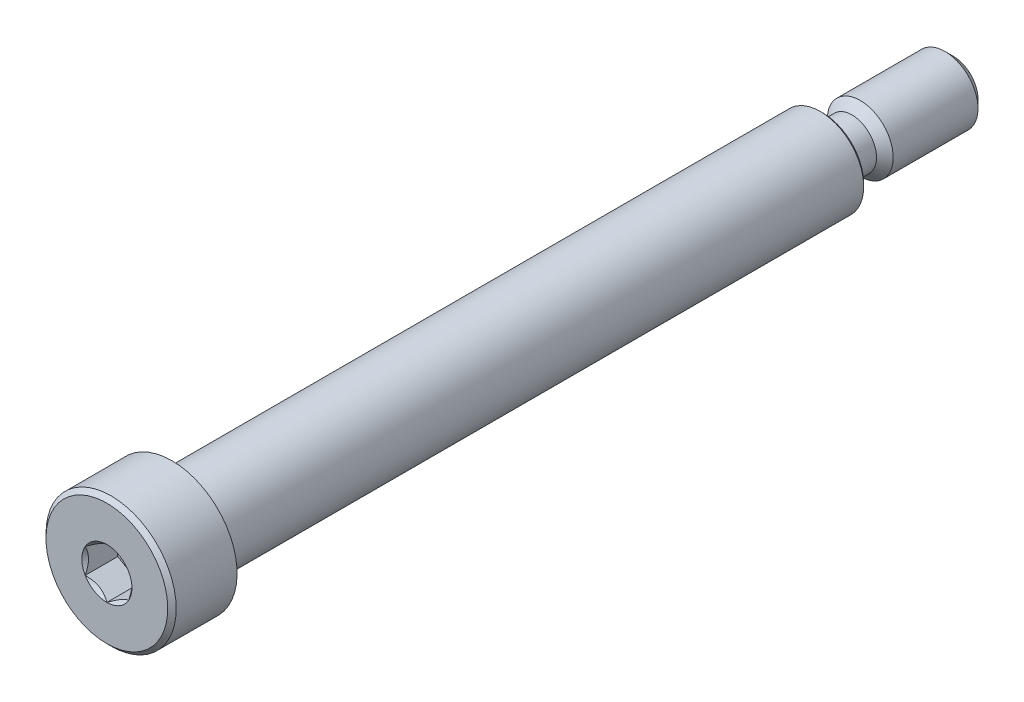
ISO-10303-21;
HEADER;
FILE_DESCRIPTION(('STEP AP214'),'2;1');
FILE_NAME('part.step','',(''),(''),'','','');
FILE_SCHEMA(('AUTOMOTIVE_DESIGN { 1 0 10303 214 1 1 1 1 }'));
ENDSEC;
DATA;
#1=APPLICATION_CONTEXT('core data for automotive mechanical design processes');
#2=APPLICATION_PROTOCOL_DEFINITION('international standard','automotive_design',2000,#1);
#3=PRODUCT_CONTEXT('',#1,'mechanical');
#4=PRODUCT('Part','Part','',(#3));
#5=PRODUCT_RELATED_PRODUCT_CATEGORY('part','',(#4));
#6=PRODUCT_DEFINITION_FORMATION('','',#4);
#7=PRODUCT_DEFINITION_CONTEXT('part definition',#1,'design');
#8=PRODUCT_DEFINITION('design','',#6,#7);
#9=PRODUCT_DEFINITION_SHAPE('','',#8);
#10=(LENGTH_UNIT() NAMED_UNIT(*) SI_UNIT(.MILLI.,.METRE.));
#11=(NAMED_UNIT(*) PLANE_ANGLE_UNIT() SI_UNIT($,.RADIAN.));
#12=(NAMED_UNIT(*) SI_UNIT($,.STERADIAN.) SOLID_ANGLE_UNIT());
#13=UNCERTAINTY_MEASURE_WITH_UNIT(LENGTH_MEASURE(1.E-05),#10,'distance_accuracy_value','');
#14=(GEOMETRIC_REPRESENTATION_CONTEXT(3) GLOBAL_UNCERTAINTY_ASSIGNED_CONTEXT((#13)) GLOBAL_UNIT_ASSIGNED_CONTEXT((#10,
#11,#12)) REPRESENTATION_CONTEXT('',''));
#15=CARTESIAN_POINT('',(0.,0.,0.));
#16=DIRECTION('',(0.,0.,1.));
#17=DIRECTION('',(1.,0.,0.));
#18=AXIS2_PLACEMENT_3D('',#15,#16,#17);
#19=CARTESIAN_POINT('',(0.,0.,0.));
#20=DIRECTION('',(0.,0.,1.));
#21=DIRECTION('',(0.,-1.,0.));
#22=AXIS2_PLACEMENT_3D('',#19,#20,#21);
#23=PLANE('',#22);
#24=CARTESIAN_POINT('',(0.,0.,0.));
#25=DIRECTION('',(0.,0.,1.));
#26=DIRECTION('',(1.,0.,0.));
#27=AXIS2_PLACEMENT_3D('',#24,#25,#26);
#28=CIRCLE('',#27,1.83308710467706);
#29=CARTESIAN_POINT('',(0.,-1.83308710467706,0.));
#30=VERTEX_POINT('',#29);
#31=CARTESIAN_POINT('',(1.58749999999999,-0.916543552338543,0.));
#32=VERTEX_POINT('',#31);
#33=EDGE_CURVE('E62',#30,#32,#28,.T.);
#34=ORIENTED_EDGE('',*,*,#33,.F.);
#35=CARTESIAN_POINT('',(-1.5875,-0.916543552338536,0.));
#36=VERTEX_POINT('',#35);
#37=EDGE_CURVE('E69',#36,#30,#28,.T.);
#38=ORIENTED_EDGE('',*,*,#37,.F.);
#39=CARTESIAN_POINT('',(-1.5875,0.916543552338528,0.));
#40=VERTEX_POINT('',#39);
#41=EDGE_CURVE('E148',#40,#36,#28,.T.);
#42=ORIENTED_EDGE('',*,*,#41,.F.);
#43=CARTESIAN_POINT('',(0.,1.83308710467706,0.));
#44=VERTEX_POINT('',#43);
#45=EDGE_CURVE('E140',#44,#40,#28,.T.);
#46=ORIENTED_EDGE('',*,*,#45,.F.);
#47=CARTESIAN_POINT('',(1.5875,0.916543552338529,0.));
#48=VERTEX_POINT('',#47);
#49=EDGE_CURVE('E111',#48,#44,#28,.T.);
#50=ORIENTED_EDGE('',*,*,#49,.F.);
#51=EDGE_CURVE('E101',#32,#48,#28,.T.);
#52=ORIENTED_EDGE('',*,*,#51,.F.);
#53=EDGE_LOOP('',(#34,#38,#42,#46,#50,#52));
#54=FACE_BOUND('',#53,.T.);
#55=CARTESIAN_POINT('',(0.,0.,0.));
#56=DIRECTION('',(0.,0.,1.));
#57=DIRECTION('',(0.,-1.,0.));
#58=AXIS2_PLACEMENT_3D('',#55,#56,#57);
#59=CIRCLE('',#58,4.45293750000001);
#60=CARTESIAN_POINT('',(0.,-4.45293750000001,0.));
#61=VERTEX_POINT('',#60);
#62=EDGE_CURVE('E234',#61,#61,#59,.T.);
#63=ORIENTED_EDGE('',*,*,#62,.T.);
#64=EDGE_LOOP('',(#63));
#65=FACE_BOUND('',#64,.T.);
#66=ADVANCED_FACE('F41',(#54,#65),#23,.T.);
#67=CARTESIAN_POINT('',(0.,0.,-61.9125));
#68=DIRECTION('',(0.,0.,-1.));
#69=DIRECTION('',(0.,1.,0.));
#70=AXIS2_PLACEMENT_3D('',#67,#68,#69);
#71=CYLINDRICAL_SURFACE('',#70,4.7625);
#72=CARTESIAN_POINT('',(0.,0.,-0.309562499999978));
#73=DIRECTION('',(0.,0.,1.));
#74=DIRECTION('',(0.,-1.,0.));
#75=AXIS2_PLACEMENT_3D('',#72,#73,#74);
#76=CIRCLE('',#75,4.7625);
#77=CARTESIAN_POINT('',(0.,-4.7625,-0.309562499999977));
#78=VERTEX_POINT('',#77);
#79=EDGE_CURVE('E237',#78,#78,#76,.F.);
#80=ORIENTED_EDGE('',*,*,#79,.T.);
#81=EDGE_LOOP('',(#80));
#82=FACE_BOUND('',#81,.T.);
#83=CARTESIAN_POINT('',(0.,0.,-4.7625));
#84=DIRECTION('',(0.,0.,-1.));
#85=DIRECTION('',(0.,1.,0.));
#86=AXIS2_PLACEMENT_3D('',#83,#84,#85);
#87=CIRCLE('',#86,4.7625);
#88=CARTESIAN_POINT('',(0.,4.76249999999999,-4.7625));
#89=VERTEX_POINT('',#88);
#90=EDGE_CURVE('E287',#89,#89,#87,.T.);
#91=ORIENTED_EDGE('',*,*,#90,.F.);
#92=EDGE_LOOP('',(#91));
#93=FACE_BOUND('',#92,.T.);
#94=ADVANCED_FACE('F210',(#82,#93),#71,.T.);
#95=CARTESIAN_POINT('',(0.,-4.7625,-4.7625));
#96=DIRECTION('',(0.,0.,-1.));
#97=DIRECTION('',(0.,1.,0.));
#98=AXIS2_PLACEMENT_3D('',#95,#96,#97);
#99=PLANE('',#98);
#100=ORIENTED_EDGE('',*,*,#90,.T.);
#101=EDGE_LOOP('',(#100));
#102=FACE_BOUND('',#101,.T.);
#103=CARTESIAN_POINT('',(0.,0.,-4.7625));
#104=DIRECTION('',(0.,0.,-1.));
#105=DIRECTION('',(0.,1.,0.));
#106=AXIS2_PLACEMENT_3D('',#103,#104,#105);
#107=CIRCLE('',#106,3.17499999999998);
#108=CARTESIAN_POINT('',(0.,3.17499999999998,-4.7625));
#109=VERTEX_POINT('',#108);
#110=EDGE_CURVE('E277',#109,#109,#107,.T.);
#111=ORIENTED_EDGE('',*,*,#110,.F.);
#112=EDGE_LOOP('',(#111));
#113=FACE_BOUND('',#112,.T.);
#114=ADVANCED_FACE('F215',(#102,#113),#99,.T.);
#115=CARTESIAN_POINT('',(0.,0.,-61.9125));
#116=DIRECTION('',(0.,0.,-1.));
#117=DIRECTION('',(0.,1.,0.));
#118=AXIS2_PLACEMENT_3D('',#115,#116,#117);
#119=CYLINDRICAL_SURFACE('',#118,3.17499999999998);
#120=CARTESIAN_POINT('',(0.,0.,-52.1843));
#121=DIRECTION('',(0.,0.,-1.));
#122=DIRECTION('',(0.,1.,0.));
#123=AXIS2_PLACEMENT_3D('',#120,#121,#122);
#124=CIRCLE('',#123,3.17499999999998);
#125=CARTESIAN_POINT('',(0.,3.17499999999997,-52.1843));
#126=VERTEX_POINT('',#125);
#127=EDGE_CURVE('E56',#126,#126,#124,.F.);
#128=ORIENTED_EDGE('',*,*,#127,.T.);
#129=EDGE_LOOP('',(#128));
#130=FACE_BOUND('',#129,.T.);
#131=ORIENTED_EDGE('',*,*,#110,.T.);
#132=EDGE_LOOP('',(#131));
#133=FACE_BOUND('',#132,.T.);
#134=ADVANCED_FACE('F256',(#130,#133),#119,.T.);
#135=CARTESIAN_POINT('',(0.,-3.17500000000001,-52.3875));
#136=DIRECTION('',(0.,0.,-1.));
#137=DIRECTION('',(0.,1.,0.));
#138=AXIS2_PLACEMENT_3D('',#135,#136,#137);
#139=PLANE('',#138);
#140=CARTESIAN_POINT('',(0.,0.,-52.3875));
#141=DIRECTION('',(0.,0.,-1.));
#142=DIRECTION('',(0.,1.,0.));
#143=AXIS2_PLACEMENT_3D('',#140,#141,#142);
#144=CIRCLE('',#143,2.97179999999999);
#145=CARTESIAN_POINT('',(0.,2.97179999999998,-52.3875));
#146=VERTEX_POINT('',#145);
#147=EDGE_CURVE('E243',#146,#146,#144,.T.);
#148=ORIENTED_EDGE('',*,*,#147,.T.);
#149=EDGE_LOOP('',(#148));
#150=FACE_BOUND('',#149,.T.);
#151=CARTESIAN_POINT('',(0.,0.,-52.3875));
#152=DIRECTION('',(0.,0.,-1.));
#153=DIRECTION('',(0.,1.,0.));
#154=AXIS2_PLACEMENT_3D('',#151,#152,#153);
#155=CIRCLE('',#154,2.41300000000004);
#156=CARTESIAN_POINT('',(0.,2.41300000000003,-52.3875));
#157=VERTEX_POINT('',#156);
#158=EDGE_CURVE('E268',#157,#157,#155,.T.);
#159=ORIENTED_EDGE('',*,*,#158,.F.);
#160=EDGE_LOOP('',(#159));
#161=FACE_BOUND('',#160,.T.);
#162=ADVANCED_FACE('F261',(#150,#161),#139,.T.);
#163=CARTESIAN_POINT('',(0.,0.,-52.9971000000001));
#164=DIRECTION('',(0.,0.,-1.));
#165=DIRECTION('',(0.,1.,0.));
#166=AXIS2_PLACEMENT_3D('',#163,#164,#165);
#167=TOROIDAL_SURFACE('',#166,2.41300000000004,0.609600000000058);
#168=CARTESIAN_POINT('',(0.,0.,-52.9971000000001));
#169=DIRECTION('',(0.,0.,-1.));
#170=DIRECTION('',(0.,1.,0.));
#171=AXIS2_PLACEMENT_3D('',#168,#169,#170);
#172=CIRCLE('',#171,1.8034);
#173=CARTESIAN_POINT('',(0.,1.80339999999998,-52.9971000000001));
#174=VERTEX_POINT('',#173);
#175=EDGE_CURVE('E272',#174,#174,#172,.T.);
#176=ORIENTED_EDGE('',*,*,#175,.F.);
#177=EDGE_LOOP('',(#176));
#178=FACE_BOUND('',#177,.T.);
#179=ORIENTED_EDGE('',*,*,#158,.T.);
#180=EDGE_LOOP('',(#179));
#181=FACE_BOUND('',#180,.T.);
#182=ADVANCED_FACE('F264',(#178,#181),#167,.F.);
#183=CARTESIAN_POINT('',(0.,0.,-61.9125));
#184=DIRECTION('',(0.,0.,-1.));
#185=DIRECTION('',(0.,1.,0.));
#186=AXIS2_PLACEMENT_3D('',#183,#184,#185);
#187=CYLINDRICAL_SURFACE('',#186,1.8034);
#188=CARTESIAN_POINT('',(0.,0.,-54.4957));
#189=DIRECTION('',(0.,0.,-1.));
#190=DIRECTION('',(0.,1.,0.));
#191=AXIS2_PLACEMENT_3D('',#188,#189,#190);
#192=CIRCLE('',#191,1.8034);
#193=CARTESIAN_POINT('',(0.,1.80339999999998,-54.4957));
#194=VERTEX_POINT('',#193);
#195=EDGE_CURVE('E280',#194,#194,#192,.T.);
#196=ORIENTED_EDGE('',*,*,#195,.F.);
#197=EDGE_LOOP('',(#196));
#198=FACE_BOUND('',#197,.T.);
#199=ORIENTED_EDGE('',*,*,#175,.T.);
#200=EDGE_LOOP('',(#199));
#201=FACE_BOUND('',#200,.T.);
#202=ADVANCED_FACE('F305',(#198,#201),#187,.T.);
#203=CARTESIAN_POINT('',(0.,0.,-54.4957));
#204=DIRECTION('',(0.,0.,-1.));
#205=DIRECTION('',(0.,1.,0.));
#206=AXIS2_PLACEMENT_3D('',#203,#204,#205);
#207=CONICAL_SURFACE('',#206,1.8034,0.785398163397437);
#208=CARTESIAN_POINT('',(0.,0.,-55.1053000000001));
#209=DIRECTION('',(0.,0.,-1.));
#210=DIRECTION('',(0.,1.,0.));
#211=AXIS2_PLACEMENT_3D('',#208,#209,#210);
#212=CIRCLE('',#211,2.41300000000004);
#213=CARTESIAN_POINT('',(0.,2.41300000000003,-55.1053000000001));
#214=VERTEX_POINT('',#213);
#215=EDGE_CURVE('E271',#214,#214,#212,.F.);
#216=ORIENTED_EDGE('',*,*,#215,.T.);
#217=EDGE_LOOP('',(#216));
#218=FACE_BOUND('',#217,.T.);
#219=ORIENTED_EDGE('',*,*,#195,.T.);
#220=EDGE_LOOP('',(#219));
#221=FACE_BOUND('',#220,.T.);
#222=ADVANCED_FACE('F297',(#218,#221),#207,.T.);
#223=CARTESIAN_POINT('',(0.,-2.41300000000006,-61.9125));
#224=DIRECTION('',(0.,0.,-1.));
#225=DIRECTION('',(0.,1.,0.));
#226=AXIS2_PLACEMENT_3D('',#223,#224,#225);
#227=PLANE('',#226);
#228=CARTESIAN_POINT('',(0.,0.,-61.9125));
#229=DIRECTION('',(0.,0.,-1.));
#230=DIRECTION('',(0.,1.,0.));
#231=AXIS2_PLACEMENT_3D('',#228,#229,#230);
#232=CIRCLE('',#231,1.80975000000005);
#233=CARTESIAN_POINT('',(0.,1.80975000000003,-61.9125));
#234=VERTEX_POINT('',#233);
#235=EDGE_CURVE('E246',#234,#234,#232,.T.);
#236=ORIENTED_EDGE('',*,*,#235,.T.);
#237=EDGE_LOOP('',(#236));
#238=FACE_BOUND('',#237,.T.);
#239=ADVANCED_FACE('F294',(#238),#227,.T.);
#240=CARTESIAN_POINT('',(0.,0.,-61.9125));
#241=DIRECTION('',(0.,0.,-1.));
#242=DIRECTION('',(0.,1.,0.));
#243=AXIS2_PLACEMENT_3D('',#240,#241,#242);
#244=CYLINDRICAL_SURFACE('',#243,2.41300000000004);
#245=CARTESIAN_POINT('',(0.,0.,-61.30925));
#246=DIRECTION('',(0.,0.,-1.));
#247=DIRECTION('',(0.,1.,0.));
#248=AXIS2_PLACEMENT_3D('',#245,#246,#247);
#249=CIRCLE('',#248,2.41300000000004);
#250=CARTESIAN_POINT('',(0.,2.41300000000003,-61.30925));
#251=VERTEX_POINT('',#250);
#252=EDGE_CURVE('E239',#251,#251,#249,.F.);
#253=ORIENTED_EDGE('',*,*,#252,.T.);
#254=EDGE_LOOP('',(#253));
#255=FACE_BOUND('',#254,.T.);
#256=ORIENTED_EDGE('',*,*,#215,.F.);
#257=EDGE_LOOP('',(#256));
#258=FACE_BOUND('',#257,.T.);
#259=ADVANCED_FACE('F223',(#255,#258),#244,.T.);
#260=CARTESIAN_POINT('',(0.,0.,-61.9125));
#261=DIRECTION('',(0.,0.,1.));
#262=DIRECTION('',(0.,-1.,0.));
#263=AXIS2_PLACEMENT_3D('',#260,#261,#262);
#264=CONICAL_SURFACE('',#263,1.80975000000005,0.785398163397456);
#265=ORIENTED_EDGE('',*,*,#252,.F.);
#266=EDGE_LOOP('',(#265));
#267=FACE_BOUND('',#266,.T.);
#268=ORIENTED_EDGE('',*,*,#235,.F.);
#269=EDGE_LOOP('',(#268));
#270=FACE_BOUND('',#269,.T.);
#271=ADVANCED_FACE('F220',(#267,#270),#264,.T.);
#272=CARTESIAN_POINT('',(0.,0.,-0.309562499999978));
#273=DIRECTION('',(0.,0.,-1.));
#274=DIRECTION('',(0.,1.,0.));
#275=AXIS2_PLACEMENT_3D('',#272,#273,#274);
#276=CONICAL_SURFACE('',#275,4.7625,0.785398163397462);
#277=ORIENTED_EDGE('',*,*,#62,.F.);
#278=EDGE_LOOP('',(#277));
#279=FACE_BOUND('',#278,.T.);
#280=ORIENTED_EDGE('',*,*,#79,.F.);
#281=EDGE_LOOP('',(#280));
#282=FACE_BOUND('',#281,.T.);
#283=ADVANCED_FACE('F222',(#279,#282),#276,.T.);
#284=CARTESIAN_POINT('',(0.,0.,-52.3875));
#285=DIRECTION('',(0.,0.,1.));
#286=DIRECTION('',(0.,-1.,0.));
#287=AXIS2_PLACEMENT_3D('',#284,#285,#286);
#288=CONICAL_SURFACE('',#287,2.97179999999999,0.785398163397447);
#289=ORIENTED_EDGE('',*,*,#127,.F.);
#290=EDGE_LOOP('',(#289));
#291=FACE_BOUND('',#290,.T.);
#292=ORIENTED_EDGE('',*,*,#147,.F.);
#293=EDGE_LOOP('',(#292));
#294=FACE_BOUND('',#293,.T.);
#295=ADVANCED_FACE('F43',(#291,#294),#288,.T.);
#296=CARTESIAN_POINT('',(0.,0.,0.));
#297=DIRECTION('',(0.,0.,1.));
#298=DIRECTION('',(1.,0.,0.));
#299=AXIS2_PLACEMENT_3D('',#296,#297,#298);
#300=CONICAL_SURFACE('',#299,1.83308710467706,0.78539816339745);
#301=ORIENTED_EDGE('',*,*,#49,.T.);
#302=CARTESIAN_POINT('',(1.5877,0.916428082284689,0.000115480963707832));
#303=CARTESIAN_POINT('',(1.53312479190086,0.947937093371806,-0.0313691916294022));
#304=CARTESIAN_POINT('',(1.47763696320971,0.979973006203391,-0.0610049539864694));
#305=CARTESIAN_POINT('',(1.36449087915364,1.04529792829091,-0.115267739979174));
#306=CARTESIAN_POINT('',(1.30682185887062,1.07859315267522,-0.139864564866823));
#307=CARTESIAN_POINT('',(1.1905349781269,1.14573141457583,-0.181999635727418));
#308=CARTESIAN_POINT('',(1.13194674474407,1.17955734689075,-0.199643807270178));
#309=CARTESIAN_POINT('',(1.01348022674557,1.24795402294714,-0.226828529915031));
#310=CARTESIAN_POINT('',(0.953605562983894,1.28252267618758,-0.236389379304923));
#311=CARTESIAN_POINT('',(0.850418771876557,1.34209759781022,-0.245015586895992));
#312=CARTESIAN_POINT('',(0.807240015952287,1.36702686416637,-0.246292807190424));
#313=CARTESIAN_POINT('',(0.720953038535398,1.41684467380557,-0.244142944185296));
#314=CARTESIAN_POINT('',(0.677844847078612,1.44173319974742,-0.240714211450657));
#315=CARTESIAN_POINT('',(0.592046335002031,1.4912689937909,-0.229349005566657));
#316=CARTESIAN_POINT('',(0.549356408925406,1.51591603410293,-0.221408628198359));
#317=CARTESIAN_POINT('',(0.464693063478359,1.56479643938728,-0.201451585548899));
#318=CARTESIAN_POINT('',(0.422719959755075,1.58902962212064,-0.18943317079131));
#319=CARTESIAN_POINT('',(0.315211458113567,1.65109968448354,-0.153753102752755));
#320=CARTESIAN_POINT('',(0.250342771708901,1.68855163804125,-0.127401427696864));
#321=CARTESIAN_POINT('',(0.154961599380925,1.74361998356043,-0.082916463148299));
#322=CARTESIAN_POINT('',(0.123530699536158,1.76176662204667,-0.0672871421988697));
#323=CARTESIAN_POINT('',(0.0612469855696382,1.79772614107137,-0.0346015121389));
#324=CARTESIAN_POINT('',(0.0303939039605778,1.81553917604369,-0.0175458843430317));
#325=CARTESIAN_POINT('',(-0.00019999999999879,1.8332025747309,0.000115480963705172));
#326=B_SPLINE_CURVE_WITH_KNOTS('',3,(#302,#303,#304,#305,#306,#307,#308,#309,#310,#311,#312,
#313,#314,#315,#316,#317,#318,#319,#320,#321,#322,#323,#324,#325),.UNSPECIFIED.,.F.,.F.,(4,2,2,
2,2,2,2,2,2,2,2,4),(0.,0.211482650810817,0.424197870807277,0.633533884524816,0.84234265326335,
0.991755553727142,1.14122083674205,1.29081565918877,1.44047473906438,1.6781878086972,
1.79671410024894,1.91518409436631),.UNSPECIFIED.);
#327=EDGE_CURVE('E11',#48,#44,#326,.T.);
#328=ORIENTED_EDGE('',*,*,#327,.F.);
#329=EDGE_LOOP('',(#301,#328));
#330=FACE_BOUND('',#329,.T.);
#331=ADVANCED_FACE('F114',(#330),#300,.F.);
#332=ORIENTED_EDGE('',*,*,#45,.T.);
#333=CARTESIAN_POINT('',(0.000200000000001031,1.8332025747309,0.000115480963705317));
#334=CARTESIAN_POINT('',(-0.0543752080991352,1.80169356364378,-0.0313691916294044));
#335=CARTESIAN_POINT('',(-0.109863036790289,1.76965765081219,-0.0610049539864712));
#336=CARTESIAN_POINT('',(-0.223009120846357,1.70433272872467,-0.115267739979176));
#337=CARTESIAN_POINT('',(-0.280678141129379,1.67103750434037,-0.139864564866825));
#338=CARTESIAN_POINT('',(-0.396965021873101,1.60389924243976,-0.181999635727419));
#339=CARTESIAN_POINT('',(-0.455553255255928,1.57007331012484,-0.199643807270179));
#340=CARTESIAN_POINT('',(-0.574019773254428,1.50167663406845,-0.226828529915032));
#341=CARTESIAN_POINT('',(-0.633894437016102,1.467107980828,-0.236389379304924));
#342=CARTESIAN_POINT('',(-0.737081228123439,1.40753305920537,-0.245015586895993));
#343=CARTESIAN_POINT('',(-0.780259984047709,1.38260379284922,-0.246292807190425));
#344=CARTESIAN_POINT('',(-0.866546961464598,1.33278598321002,-0.244142944185296));
#345=CARTESIAN_POINT('',(-0.909655152921384,1.30789745726817,-0.240714211450658));
#346=CARTESIAN_POINT('',(-0.995453664997965,1.25836166322468,-0.229349005566658));
#347=CARTESIAN_POINT('',(-1.03814359107459,1.23371462291266,-0.221408628198359));
#348=CARTESIAN_POINT('',(-1.12280693652164,1.18483421762831,-0.2014515855489));
#349=CARTESIAN_POINT('',(-1.16478004024492,1.16060103489495,-0.189433170791311));
#350=CARTESIAN_POINT('',(-1.27228854188643,1.09853097253205,-0.153753102752755));
#351=CARTESIAN_POINT('',(-1.3371572282911,1.06107901897434,-0.127401427696864));
#352=CARTESIAN_POINT('',(-1.43253840061907,1.00601067345516,-0.0829164631482986));
#353=CARTESIAN_POINT('',(-1.46396930046384,0.987864034968911,-0.0672871421988691));
#354=CARTESIAN_POINT('',(-1.52625301443036,0.951904515944211,-0.034601512138899));
#355=CARTESIAN_POINT('',(-1.55710609603942,0.934091480971891,-0.0175458843430304));
#356=CARTESIAN_POINT('',(-1.5877,0.91642808228469,0.000115480963706775));
#357=B_SPLINE_CURVE_WITH_KNOTS('',3,(#333,#334,#335,#336,#337,#338,#339,#340,#341,#342,#343,
#344,#345,#346,#347,#348,#349,#350,#351,#352,#353,#354,#355,#356),.UNSPECIFIED.,.F.,.F.,(4,2,2,
2,2,2,2,2,2,2,2,4),(0.,0.211482650810816,0.424197870807274,0.633533884524813,0.842342653263345,
0.991755553727138,1.14122083674204,1.29081565918877,1.44047473906437,1.6781878086972,
1.79671410024894,1.91518409436631),.UNSPECIFIED.);
#358=EDGE_CURVE('E142',#44,#40,#357,.T.);
#359=ORIENTED_EDGE('',*,*,#358,.F.);
#360=EDGE_LOOP('',(#332,#359));
#361=FACE_BOUND('',#360,.T.);
#362=ADVANCED_FACE('F425',(#361),#300,.F.);
#363=ORIENTED_EDGE('',*,*,#41,.T.);
#364=CARTESIAN_POINT('',(-1.5875,-1.82796193726259,0.587987263053262));
#365=CARTESIAN_POINT('',(-1.5875,-1.78345227615059,0.55438665248245));
#366=CARTESIAN_POINT('',(-1.5875,-1.73869460859014,0.521115495112821));
#367=CARTESIAN_POINT('',(-1.5875,-1.64858256596373,0.455368117663873));
#368=CARTESIAN_POINT('',(-1.5875,-1.60322804392558,0.422892099235921));
#369=CARTESIAN_POINT('',(-1.5875,-1.46545441976762,0.326397611985418));
#370=CARTESIAN_POINT('',(-1.5875,-1.37200191342501,0.263830163460007));
#371=CARTESIAN_POINT('',(-1.5875,-1.17603564989745,0.141002804434972));
#372=CARTESIAN_POINT('',(-1.5875,-1.07330915468728,0.0810784496591046));
#373=CARTESIAN_POINT('',(-1.5875,-0.862725191083303,-0.0285359673271802));
#374=CARTESIAN_POINT('',(-1.5875,-0.754886591626397,-0.0782605310350632));
#375=CARTESIAN_POINT('',(-1.5875,-0.593019911814796,-0.139093925910703));
#376=CARTESIAN_POINT('',(-1.5875,-0.541388281953348,-0.156553547956909));
#377=CARTESIAN_POINT('',(-1.5875,-0.436878539644853,-0.187327632152252));
#378=CARTESIAN_POINT('',(-1.5875,-0.384000341596423,-0.200641808737995));
#379=CARTESIAN_POINT('',(-1.5875,-0.278196924179275,-0.222211694528));
#380=CARTESIAN_POINT('',(-1.5875,-0.22528965378016,-0.230554072010502));
#381=CARTESIAN_POINT('',(-1.5875,-0.118909299444438,-0.24201748229947));
#382=CARTESIAN_POINT('',(-1.5875,-0.0654363143610335,-0.245139412645061));
#383=CARTESIAN_POINT('',(-1.5875,0.0396125417767711,-0.245930358907866));
#384=CARTESIAN_POINT('',(-1.5875,0.0911870236203144,-0.243792656984369));
#385=CARTESIAN_POINT('',(-1.5875,0.193894009138673,-0.234608631517596));
#386=CARTESIAN_POINT('',(-1.5875,0.245026469388833,-0.227561831125049));
#387=CARTESIAN_POINT('',(-1.5875,0.347344844875251,-0.208824783303615));
#388=CARTESIAN_POINT('',(-1.5875,0.398516068928429,-0.197055516419633));
#389=CARTESIAN_POINT('',(-1.5875,0.49974044612459,-0.169499053465113));
#390=CARTESIAN_POINT('',(-1.5875,0.549793692439816,-0.153712193590009));
#391=CARTESIAN_POINT('',(-1.5875,0.70738077418726,-0.0980702216941557));
#392=CARTESIAN_POINT('',(-1.5875,0.812671634229884,-0.051878137425492));
#393=CARTESIAN_POINT('',(-1.5875,1.01830702558101,0.0508243359443616));
#394=CARTESIAN_POINT('',(-1.5875,1.11863208625861,0.10737179555309));
#395=CARTESIAN_POINT('',(-1.5875,1.3103677282283,0.224034193371491));
#396=CARTESIAN_POINT('',(-1.5875,1.40197355475198,0.283832216072681));
#397=CARTESIAN_POINT('',(-1.5875,1.53693633949296,0.376273802504082));
#398=CARTESIAN_POINT('',(-1.5875,1.58134147344183,0.407413627936379));
#399=CARTESIAN_POINT('',(-1.5875,1.66954488852479,0.470516819770575));
#400=CARTESIAN_POINT('',(-1.5875,1.7133433331845,0.502479957344863));
#401=CARTESIAN_POINT('',(-1.5875,1.75688919237298,0.534784489028341));
#402=B_SPLINE_CURVE_WITH_KNOTS('',3,(#364,#365,#366,#367,#368,#369,#370,#371,#372,#373,#374,
#375,#376,#377,#378,#379,#380,#381,#382,#383,#384,#385,#386,#387,#388,#389,#390,#391,#392,#393,
#394,#395,#396,#397,#398,#399,#400,#401),.UNSPECIFIED.,.F.,.F.,(4,2,2,2,2,2,2,2,2,2,2,2,2,2,2,2,
2,2,4),(0.,0.167300856006658,0.334643709885256,0.671883358358867,1.02837224619094,
1.38363464340873,1.54700775526169,1.71039211875551,1.87083807337659,2.03125644006704,
2.18586834446828,2.34049526931702,2.49782525404182,2.65514207759268,2.9990629992233,
3.34424006226482,3.67226428573993,3.83496498308973,3.99762093796192),.UNSPECIFIED.);
#403=EDGE_CURVE('E146',#40,#36,#402,.F.);
#404=ORIENTED_EDGE('',*,*,#403,.F.);
#405=EDGE_LOOP('',(#363,#404));
#406=FACE_BOUND('',#405,.T.);
#407=ADVANCED_FACE('F432',(#406),#300,.F.);
#408=ORIENTED_EDGE('',*,*,#37,.T.);
#409=CARTESIAN_POINT('',(-1.5877,-0.916428082284698,0.000115480963710651));
#410=CARTESIAN_POINT('',(-1.53312479190086,-0.947937093371814,-0.0313691916293989));
#411=CARTESIAN_POINT('',(-1.47763696320971,-0.979973006203399,-0.0610049539864657));
#412=CARTESIAN_POINT('',(-1.36449087915364,-1.04529792829092,-0.11526773997917));
#413=CARTESIAN_POINT('',(-1.30682185887062,-1.07859315267523,-0.139864564866819));
#414=CARTESIAN_POINT('',(-1.1905349781269,-1.14573141457584,-0.181999635727413));
#415=CARTESIAN_POINT('',(-1.13194674474407,-1.17955734689076,-0.199643807270173));
#416=CARTESIAN_POINT('',(-1.01348022674557,-1.24795402294715,-0.226828529915025));
#417=CARTESIAN_POINT('',(-0.953605562983896,-1.28252267618759,-0.236389379304917));
#418=CARTESIAN_POINT('',(-0.850418771876559,-1.34209759781022,-0.245015586895986));
#419=CARTESIAN_POINT('',(-0.807240015952289,-1.36702686416637,-0.246292807190418));
#420=CARTESIAN_POINT('',(-0.7209530385354,-1.41684467380557,-0.244142944185289));
#421=CARTESIAN_POINT('',(-0.677844847078613,-1.44173319974743,-0.240714211450651));
#422=CARTESIAN_POINT('',(-0.592046335002032,-1.49126899379091,-0.229349005566651));
#423=CARTESIAN_POINT('',(-0.549356408925408,-1.51591603410293,-0.221408628198353));
#424=CARTESIAN_POINT('',(-0.46469306347836,-1.56479643938728,-0.201451585548893));
#425=CARTESIAN_POINT('',(-0.422719959755076,-1.58902962212064,-0.189433170791304));
#426=CARTESIAN_POINT('',(-0.315211458113566,-1.65109968448354,-0.153753102752748));
#427=CARTESIAN_POINT('',(-0.2503427717089,-1.68855163804125,-0.127401427696857));
#428=CARTESIAN_POINT('',(-0.154961599380923,-1.74361998356043,-0.0829164631482915));
#429=CARTESIAN_POINT('',(-0.123530699536156,-1.76176662204668,-0.0672871421988619));
#430=CARTESIAN_POINT('',(-0.0612469855696354,-1.79772614107138,-0.0346015121388917));
#431=CARTESIAN_POINT('',(-0.0303939039605748,-1.8155391760437,-0.0175458843430231));
#432=CARTESIAN_POINT('',(0.000200000000002062,-1.8332025747309,0.000115480963713714));
#433=B_SPLINE_CURVE_WITH_KNOTS('',3,(#409,#410,#411,#412,#413,#414,#415,#416,#417,#418,#419,
#420,#421,#422,#423,#424,#425,#426,#427,#428,#429,#430,#431,#432),.UNSPECIFIED.,.F.,.F.,(4,2,2,
2,2,2,2,2,2,2,2,4),(0.,0.211482650810815,0.424197870807274,0.633533884524812,0.842342653263344,
0.991755553727137,1.14122083674204,1.29081565918877,1.44047473906437,1.6781878086972,
1.79671410024894,1.91518409436631),.UNSPECIFIED.);
#434=EDGE_CURVE('E174',#36,#30,#433,.T.);
#435=ORIENTED_EDGE('',*,*,#434,.F.);
#436=EDGE_LOOP('',(#408,#435));
#437=FACE_BOUND('',#436,.T.);
#438=ADVANCED_FACE('F440',(#437),#300,.F.);
#439=ORIENTED_EDGE('',*,*,#33,.T.);
#440=CARTESIAN_POINT('',(-0.000199999999997881,-1.8332025747309,0.000115480963714009));
#441=CARTESIAN_POINT('',(0.0543752080991385,-1.80169356364379,-0.0313691916293958));
#442=CARTESIAN_POINT('',(0.109863036790292,-1.7696576508122,-0.0610049539864627));
#443=CARTESIAN_POINT('',(0.223009120846361,-1.70433272872468,-0.115267739979167));
#444=CARTESIAN_POINT('',(0.280678141129383,-1.67103750434037,-0.139864564866816));
#445=CARTESIAN_POINT('',(0.396965021873105,-1.60389924243976,-0.181999635727411));
#446=CARTESIAN_POINT('',(0.455553255255933,-1.57007331012484,-0.19964380727017));
#447=CARTESIAN_POINT('',(0.574019773254433,-1.50167663406845,-0.226828529915024));
#448=CARTESIAN_POINT('',(0.633894437016107,-1.46710798082801,-0.236389379304915));
#449=CARTESIAN_POINT('',(0.737081228123444,-1.40753305920538,-0.245015586895984));
#450=CARTESIAN_POINT('',(0.780259984047714,-1.38260379284923,-0.246292807190416));
#451=CARTESIAN_POINT('',(0.866546961464604,-1.33278598321003,-0.244142944185288));
#452=CARTESIAN_POINT('',(0.90965515292139,-1.30789745726817,-0.240714211450649));
#453=CARTESIAN_POINT('',(0.995453664997972,-1.25836166322469,-0.229349005566649));
#454=CARTESIAN_POINT('',(1.0381435910746,-1.23371462291266,-0.221408628198351));
#455=CARTESIAN_POINT('',(1.12280693652164,-1.18483421762832,-0.201451585548891));
#456=CARTESIAN_POINT('',(1.16478004024493,-1.16060103489496,-0.189433170791301));
#457=CARTESIAN_POINT('',(1.27228854188644,-1.09853097253206,-0.153753102752747));
#458=CARTESIAN_POINT('',(1.3371572282911,-1.06107901897435,-0.127401427696856));
#459=CARTESIAN_POINT('',(1.43253840061908,-1.00601067345517,-0.0829164631482913));
#460=CARTESIAN_POINT('',(1.46396930046384,-0.987864034968919,-0.067287142198862));
#461=CARTESIAN_POINT('',(1.52625301443036,-0.95190451594422,-0.0346015121388923));
#462=CARTESIAN_POINT('',(1.55710609603942,-0.934091480971899,-0.017545884343024));
#463=CARTESIAN_POINT('',(1.5877,-0.916428082284699,0.000115480963712603));
#464=B_SPLINE_CURVE_WITH_KNOTS('',3,(#440,#441,#442,#443,#444,#445,#446,#447,#448,#449,#450,
#451,#452,#453,#454,#455,#456,#457,#458,#459,#460,#461,#462,#463),.UNSPECIFIED.,.F.,.F.,(4,2,2,
2,2,2,2,2,2,2,2,4),(0.,0.211482650810816,0.424197870807275,0.633533884524815,0.842342653263347,
0.991755553727141,1.14122083674205,1.29081565918877,1.44047473906438,1.6781878086972,
1.79671410024894,1.91518409436631),.UNSPECIFIED.);
#465=EDGE_CURVE('E127',#30,#32,#464,.T.);
#466=ORIENTED_EDGE('',*,*,#465,.F.);
#467=EDGE_LOOP('',(#439,#466));
#468=FACE_BOUND('',#467,.T.);
#469=ADVANCED_FACE('F167',(#468),#300,.F.);
#470=ORIENTED_EDGE('',*,*,#51,.T.);
#471=CARTESIAN_POINT('',(1.5875,-1.82796193726259,0.587987263053263));
#472=CARTESIAN_POINT('',(1.5875,-1.78345227615059,0.554386652482452));
#473=CARTESIAN_POINT('',(1.5875,-1.73869460859014,0.521115495112822));
#474=CARTESIAN_POINT('',(1.5875,-1.64858256596373,0.455368117663875));
#475=CARTESIAN_POINT('',(1.5875,-1.60322804392558,0.422892099235922));
#476=CARTESIAN_POINT('',(1.5875,-1.46545441976762,0.326397611985419));
#477=CARTESIAN_POINT('',(1.5875,-1.37200191342501,0.263830163460008));
#478=CARTESIAN_POINT('',(1.5875,-1.17603564989745,0.141002804434973));
#479=CARTESIAN_POINT('',(1.5875,-1.07330915468728,0.0810784496591058));
#480=CARTESIAN_POINT('',(1.5875,-0.862725191083303,-0.0285359673271791));
#481=CARTESIAN_POINT('',(1.5875,-0.754886591626397,-0.078260531035062));
#482=CARTESIAN_POINT('',(1.5875,-0.593019911814796,-0.139093925910701));
#483=CARTESIAN_POINT('',(1.5875,-0.541388281953348,-0.156553547956908));
#484=CARTESIAN_POINT('',(1.5875,-0.436878539644853,-0.18732763215225));
#485=CARTESIAN_POINT('',(1.5875,-0.384000341596423,-0.200641808737993));
#486=CARTESIAN_POINT('',(1.5875,-0.278196924179275,-0.222211694527998));
#487=CARTESIAN_POINT('',(1.5875,-0.225289653780159,-0.230554072010501));
#488=CARTESIAN_POINT('',(1.5875,-0.118909299444438,-0.242017482299468));
#489=CARTESIAN_POINT('',(1.5875,-0.0654363143610332,-0.245139412645059));
#490=CARTESIAN_POINT('',(1.5875,0.0396125417767714,-0.245930358907864));
#491=CARTESIAN_POINT('',(1.5875,0.0911870236203149,-0.243792656984367));
#492=CARTESIAN_POINT('',(1.5875,0.193894009138674,-0.234608631517594));
#493=CARTESIAN_POINT('',(1.5875,0.245026469388833,-0.227561831125047));
#494=CARTESIAN_POINT('',(1.5875,0.347344844875252,-0.208824783303613));
#495=CARTESIAN_POINT('',(1.5875,0.39851606892843,-0.197055516419631));
#496=CARTESIAN_POINT('',(1.5875,0.499740446124591,-0.169499053465111));
#497=CARTESIAN_POINT('',(1.5875,0.549793692439817,-0.153712193590007));
#498=CARTESIAN_POINT('',(1.5875,0.707380774187261,-0.098070221694154));
#499=CARTESIAN_POINT('',(1.5875,0.812671634229884,-0.0518781374254901));
#500=CARTESIAN_POINT('',(1.5875,1.01830702558102,0.0508243359443637));
#501=CARTESIAN_POINT('',(1.5875,1.11863208625861,0.107371795553092));
#502=CARTESIAN_POINT('',(1.5875,1.3103677282283,0.224034193371493));
#503=CARTESIAN_POINT('',(1.5875,1.40197355475198,0.283832216072683));
#504=CARTESIAN_POINT('',(1.5875,1.53693633949296,0.376273802504084));
#505=CARTESIAN_POINT('',(1.5875,1.58134147344183,0.407413627936381));
#506=CARTESIAN_POINT('',(1.5875,1.66954488852479,0.470516819770577));
#507=CARTESIAN_POINT('',(1.5875,1.7133433331845,0.502479957344865));
#508=CARTESIAN_POINT('',(1.5875,1.75688919237298,0.534784489028343));
#509=B_SPLINE_CURVE_WITH_KNOTS('',3,(#471,#472,#473,#474,#475,#476,#477,#478,#479,#480,#481,
#482,#483,#484,#485,#486,#487,#488,#489,#490,#491,#492,#493,#494,#495,#496,#497,#498,#499,#500,
#501,#502,#503,#504,#505,#506,#507,#508),.UNSPECIFIED.,.F.,.F.,(4,2,2,2,2,2,2,2,2,2,2,2,2,2,2,2,
2,2,4),(0.,0.167300856006658,0.334643709885257,0.671883358358867,1.02837224619094,
1.38363464340873,1.5470077552617,1.71039211875551,1.87083807337659,2.03125644006704,
2.18586834446828,2.34049526931702,2.49782525404183,2.65514207759269,2.9990629992233,
3.34424006226483,3.67226428573993,3.83496498308973,3.99762093796192),.UNSPECIFIED.);
#510=EDGE_CURVE('E105',#32,#48,#509,.T.);
#511=ORIENTED_EDGE('',*,*,#510,.F.);
#512=EDGE_LOOP('',(#470,#511));
#513=FACE_BOUND('',#512,.T.);
#514=ADVANCED_FACE('F103',(#513),#300,.F.);
#515=CARTESIAN_POINT('',(0.,0.,-2.38125));
#516=DIRECTION('',(0.,0.,1.));
#517=DIRECTION('',(1.,0.,0.));
#518=AXIS2_PLACEMENT_3D('',#515,#516,#517);
#519=PLANE('',#518);
#520=DIRECTION('',(0.,1.,0.));
#521=VECTOR('',#520,1.);
#522=CARTESIAN_POINT('',(1.5875,-0.916543552338537,-2.38125));
#523=LINE('',#522,#521);
#524=CARTESIAN_POINT('',(1.5875,-0.916543552338537,-2.38125));
#525=VERTEX_POINT('',#524);
#526=CARTESIAN_POINT('',(1.5875,0.916543552338527,-2.38125));
#527=VERTEX_POINT('',#526);
#528=EDGE_CURVE('E126',#525,#527,#523,.T.);
#529=ORIENTED_EDGE('',*,*,#528,.T.);
#530=DIRECTION('',(-0.866025403784439,0.5,0.));
#531=VECTOR('',#530,1.);
#532=CARTESIAN_POINT('',(1.5875,0.916543552338527,-2.38125));
#533=LINE('',#532,#531);
#534=CARTESIAN_POINT('',(0.,1.83308710467706,-2.38125));
#535=VERTEX_POINT('',#534);
#536=EDGE_CURVE('E131',#527,#535,#533,.T.);
#537=ORIENTED_EDGE('',*,*,#536,.T.);
#538=DIRECTION('',(-0.866025403784439,-0.5,0.));
#539=VECTOR('',#538,1.);
#540=CARTESIAN_POINT('',(0.,1.83308710467706,-2.38125));
#541=LINE('',#540,#539);
#542=CARTESIAN_POINT('',(-1.5875,0.916543552338528,-2.38125));
#543=VERTEX_POINT('',#542);
#544=EDGE_CURVE('E508',#535,#543,#541,.T.);
#545=ORIENTED_EDGE('',*,*,#544,.T.);
#546=DIRECTION('',(0.,-1.,0.));
#547=VECTOR('',#546,1.);
#548=CARTESIAN_POINT('',(-1.5875,0.916543552338528,-2.38125));
#549=LINE('',#548,#547);
#550=CARTESIAN_POINT('',(-1.5875,-0.916543552338536,-2.38125));
#551=VERTEX_POINT('',#550);
#552=EDGE_CURVE('E479',#543,#551,#549,.T.);
#553=ORIENTED_EDGE('',*,*,#552,.T.);
#554=DIRECTION('',(0.866025403784439,-0.5,0.));
#555=VECTOR('',#554,1.);
#556=CARTESIAN_POINT('',(-1.5875,-0.916543552338536,-2.38125));
#557=LINE('',#556,#555);
#558=CARTESIAN_POINT('',(0.,-1.83308710467707,-2.38125));
#559=VERTEX_POINT('',#558);
#560=EDGE_CURVE('E502',#551,#559,#557,.T.);
#561=ORIENTED_EDGE('',*,*,#560,.T.);
#562=DIRECTION('',(0.866025403784439,0.5,0.));
#563=VECTOR('',#562,1.);
#564=CARTESIAN_POINT('',(0.,-1.83308710467707,-2.38125));
#565=LINE('',#564,#563);
#566=EDGE_CURVE('E135',#559,#525,#565,.T.);
#567=ORIENTED_EDGE('',*,*,#566,.T.);
#568=EDGE_LOOP('',(#529,#537,#545,#553,#561,#567));
#569=FACE_BOUND('',#568,.T.);
#570=ADVANCED_FACE('F166',(#569),#519,.T.);
#571=CARTESIAN_POINT('',(1.5875,0.916543552338527,-2.38125));
#572=DIRECTION('',(0.5,0.866025403784439,0.));
#573=DIRECTION('',(-0.866025403784439,0.5,0.));
#574=AXIS2_PLACEMENT_3D('',#571,#572,#573);
#575=PLANE('',#574);
#576=DIRECTION('',(0.,0.,1.));
#577=VECTOR('',#576,1.);
#578=CARTESIAN_POINT('',(1.5875,0.916543552338527,-2.38125));
#579=LINE('',#578,#577);
#580=EDGE_CURVE('E122',#527,#48,#579,.T.);
#581=ORIENTED_EDGE('',*,*,#580,.T.);
#582=ORIENTED_EDGE('',*,*,#327,.T.);
#583=DIRECTION('',(0.,0.,1.));
#584=VECTOR('',#583,1.);
#585=CARTESIAN_POINT('',(0.,1.83308710467706,-2.38125));
#586=LINE('',#585,#584);
#587=EDGE_CURVE('E134',#535,#44,#586,.T.);
#588=ORIENTED_EDGE('',*,*,#587,.F.);
#589=ORIENTED_EDGE('',*,*,#536,.F.);
#590=EDGE_LOOP('',(#581,#582,#588,#589));
#591=FACE_BOUND('',#590,.T.);
#592=ADVANCED_FACE('F129',(#591),#575,.F.);
#593=CARTESIAN_POINT('',(0.,1.83308710467706,-2.38125));
#594=DIRECTION('',(-0.5,0.866025403784439,0.));
#595=DIRECTION('',(-0.866025403784439,-0.5,0.));
#596=AXIS2_PLACEMENT_3D('',#593,#594,#595);
#597=PLANE('',#596);
#598=ORIENTED_EDGE('',*,*,#587,.T.);
#599=ORIENTED_EDGE('',*,*,#358,.T.);
#600=DIRECTION('',(0.,0.,1.));
#601=VECTOR('',#600,1.);
#602=CARTESIAN_POINT('',(-1.5875,0.916543552338528,-2.38125));
#603=LINE('',#602,#601);
#604=EDGE_CURVE('E476',#543,#40,#603,.T.);
#605=ORIENTED_EDGE('',*,*,#604,.F.);
#606=ORIENTED_EDGE('',*,*,#544,.F.);
#607=EDGE_LOOP('',(#598,#599,#605,#606));
#608=FACE_BOUND('',#607,.T.);
#609=ADVANCED_FACE('F161',(#608),#597,.F.);
#610=CARTESIAN_POINT('',(-1.5875,0.916543552338528,-2.38125));
#611=DIRECTION('',(-1.,0.,0.));
#612=DIRECTION('',(0.,0.,1.));
#613=AXIS2_PLACEMENT_3D('',#610,#611,#612);
#614=PLANE('',#613);
#615=ORIENTED_EDGE('',*,*,#604,.T.);
#616=ORIENTED_EDGE('',*,*,#403,.T.);
#617=DIRECTION('',(0.,0.,1.));
#618=VECTOR('',#617,1.);
#619=CARTESIAN_POINT('',(-1.5875,-0.916543552338536,-2.38125));
#620=LINE('',#619,#618);
#621=EDGE_CURVE('E482',#551,#36,#620,.T.);
#622=ORIENTED_EDGE('',*,*,#621,.F.);
#623=ORIENTED_EDGE('',*,*,#552,.F.);
#624=EDGE_LOOP('',(#615,#616,#622,#623));
#625=FACE_BOUND('',#624,.T.);
#626=ADVANCED_FACE('F199',(#625),#614,.F.);
#627=CARTESIAN_POINT('',(-1.5875,-0.916543552338536,-2.38125));
#628=DIRECTION('',(-0.5,-0.866025403784439,0.));
#629=DIRECTION('',(0.866025403784439,-0.5,0.));
#630=AXIS2_PLACEMENT_3D('',#627,#628,#629);
#631=PLANE('',#630);
#632=ORIENTED_EDGE('',*,*,#621,.T.);
#633=ORIENTED_EDGE('',*,*,#434,.T.);
#634=DIRECTION('',(0.,0.,1.));
#635=VECTOR('',#634,1.);
#636=CARTESIAN_POINT('',(0.,-1.83308710467707,-2.38125));
#637=LINE('',#636,#635);
#638=EDGE_CURVE('E486',#559,#30,#637,.T.);
#639=ORIENTED_EDGE('',*,*,#638,.F.);
#640=ORIENTED_EDGE('',*,*,#560,.F.);
#641=EDGE_LOOP('',(#632,#633,#639,#640));
#642=FACE_BOUND('',#641,.T.);
#643=ADVANCED_FACE('F195',(#642),#631,.F.);
#644=CARTESIAN_POINT('',(0.,-1.83308710467707,-2.38125));
#645=DIRECTION('',(0.5,-0.866025403784439,0.));
#646=DIRECTION('',(0.866025403784439,0.5,0.));
#647=AXIS2_PLACEMENT_3D('',#644,#645,#646);
#648=PLANE('',#647);
#649=ORIENTED_EDGE('',*,*,#638,.T.);
#650=ORIENTED_EDGE('',*,*,#465,.T.);
#651=DIRECTION('',(0.,0.,1.));
#652=VECTOR('',#651,1.);
#653=CARTESIAN_POINT('',(1.5875,-0.916543552338537,-2.38125));
#654=LINE('',#653,#652);
#655=EDGE_CURVE('E124',#525,#32,#654,.T.);
#656=ORIENTED_EDGE('',*,*,#655,.F.);
#657=ORIENTED_EDGE('',*,*,#566,.F.);
#658=EDGE_LOOP('',(#649,#650,#656,#657));
#659=FACE_BOUND('',#658,.T.);
#660=ADVANCED_FACE('F192',(#659),#648,.F.);
#661=CARTESIAN_POINT('',(1.5875,-0.916543552338537,-2.38125));
#662=DIRECTION('',(1.,0.,0.));
#663=DIRECTION('',(0.,0.,-1.));
#664=AXIS2_PLACEMENT_3D('',#661,#662,#663);
#665=PLANE('',#664);
#666=ORIENTED_EDGE('',*,*,#655,.T.);
#667=ORIENTED_EDGE('',*,*,#510,.T.);
#668=ORIENTED_EDGE('',*,*,#580,.F.);
#669=ORIENTED_EDGE('',*,*,#528,.F.);
#670=EDGE_LOOP('',(#666,#667,#668,#669));
#671=FACE_BOUND('',#670,.T.);
#672=ADVANCED_FACE('F120',(#671),#665,.F.);
#673=CLOSED_SHELL('',(#66,#94,#114,#134,#162,#182,#202,#222,#239,#259,#271,#283,#295,#331,#362,
#407,#438,#469,#514,#570,#592,#609,#626,#643,#660,#672));
#674=MANIFOLD_SOLID_BREP('B2',#673);
#675=ADVANCED_BREP_SHAPE_REPRESENTATION('',(#18,#674),#14);
#676=SHAPE_DEFINITION_REPRESENTATION(#9,#675);
ENDSEC;
END-ISO-10303-21;
